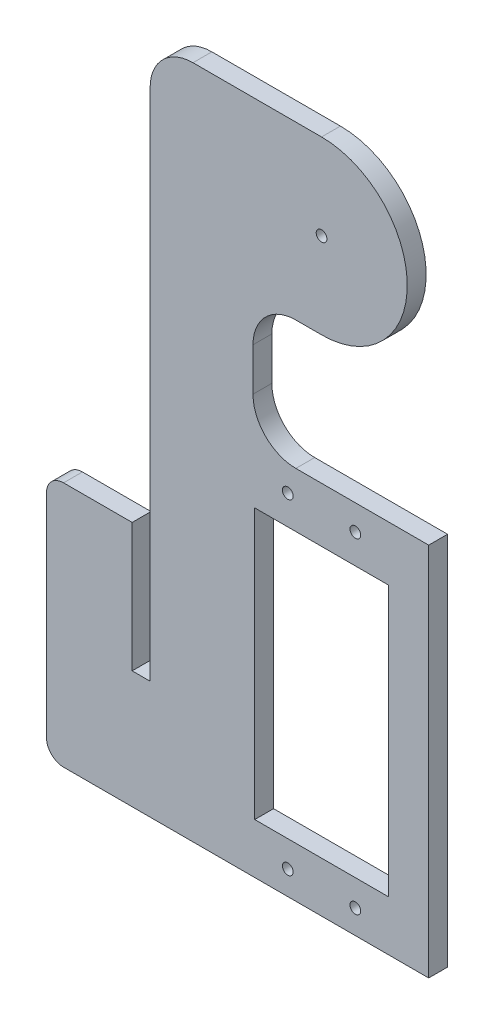
ISO-10303-21;
HEADER;
FILE_DESCRIPTION(('STEP AP214'),'2;1');
FILE_NAME('part.step','',(''),(''),'','','');
FILE_SCHEMA(('AUTOMOTIVE_DESIGN { 1 0 10303 214 1 1 1 1 }'));
ENDSEC;
DATA;
#1=APPLICATION_CONTEXT('core data for automotive mechanical design processes');
#2=APPLICATION_PROTOCOL_DEFINITION('international standard','automotive_design',2000,#1);
#3=PRODUCT_CONTEXT('',#1,'mechanical');
#4=PRODUCT('Part','Part','',(#3));
#5=PRODUCT_RELATED_PRODUCT_CATEGORY('part','',(#4));
#6=PRODUCT_DEFINITION_FORMATION('','',#4);
#7=PRODUCT_DEFINITION_CONTEXT('part definition',#1,'design');
#8=PRODUCT_DEFINITION('design','',#6,#7);
#9=PRODUCT_DEFINITION_SHAPE('','',#8);
#10=(LENGTH_UNIT() NAMED_UNIT(*) SI_UNIT(.MILLI.,.METRE.));
#11=(NAMED_UNIT(*) PLANE_ANGLE_UNIT() SI_UNIT($,.RADIAN.));
#12=(NAMED_UNIT(*) SI_UNIT($,.STERADIAN.) SOLID_ANGLE_UNIT());
#13=UNCERTAINTY_MEASURE_WITH_UNIT(LENGTH_MEASURE(1.E-05),#10,'distance_accuracy_value','');
#14=(GEOMETRIC_REPRESENTATION_CONTEXT(3) GLOBAL_UNCERTAINTY_ASSIGNED_CONTEXT((#13)) GLOBAL_UNIT_ASSIGNED_CONTEXT((#10,
#11,#12)) REPRESENTATION_CONTEXT('',''));
#15=CARTESIAN_POINT('',(0.,0.,0.));
#16=DIRECTION('',(0.,0.,1.));
#17=DIRECTION('',(1.,0.,0.));
#18=AXIS2_PLACEMENT_3D('',#15,#16,#17);
#19=CARTESIAN_POINT('',(34.925,92.0271852625298,2.794));
#20=DIRECTION('',(0.,0.,1.));
#21=DIRECTION('',(1.,0.,0.));
#22=AXIS2_PLACEMENT_3D('',#19,#20,#21);
#23=PLANE('',#22);
#24=CARTESIAN_POINT('',(29.9212,56.5179852625298,2.794));
#25=DIRECTION('',(0.,0.,1.));
#26=DIRECTION('',(1.,0.,0.));
#27=AXIS2_PLACEMENT_3D('',#24,#25,#26);
#28=CIRCLE('',#27,0.793749999999999);
#29=CARTESIAN_POINT('',(30.71495,56.5179852625298,2.794));
#30=VERTEX_POINT('',#29);
#31=EDGE_CURVE('E654',#30,#30,#28,.T.);
#32=ORIENTED_EDGE('',*,*,#31,.F.);
#33=EDGE_LOOP('',(#32));
#34=FACE_BOUND('',#33,.T.);
#35=CARTESIAN_POINT('',(34.925,92.0271852625298,2.794));
#36=DIRECTION('',(0.,0.,1.));
#37=DIRECTION('',(1.,0.,0.));
#38=AXIS2_PLACEMENT_3D('',#35,#36,#37);
#39=CIRCLE('',#38,0.793749999999993);
#40=CARTESIAN_POINT('',(35.71875,92.0271852625298,2.794));
#41=VERTEX_POINT('',#40);
#42=EDGE_CURVE('E666',#41,#41,#39,.T.);
#43=ORIENTED_EDGE('',*,*,#42,.F.);
#44=EDGE_LOOP('',(#43));
#45=FACE_BOUND('',#44,.T.);
#46=DIRECTION('',(-1.,0.,0.));
#47=VECTOR('',#46,1.);
#48=CARTESIAN_POINT('',(25.019,52.1771852625298,2.794));
#49=LINE('',#48,#47);
#50=CARTESIAN_POINT('',(44.831,52.1771852625298,2.794));
#51=VERTEX_POINT('',#50);
#52=CARTESIAN_POINT('',(25.019,52.1771852625298,2.794));
#53=VERTEX_POINT('',#52);
#54=EDGE_CURVE('E192',#51,#53,#49,.T.);
#55=ORIENTED_EDGE('',*,*,#54,.F.);
#56=DIRECTION('',(0.,1.,0.));
#57=VECTOR('',#56,1.);
#58=CARTESIAN_POINT('',(44.831,52.1771852625298,2.794));
#59=LINE('',#58,#57);
#60=CARTESIAN_POINT('',(44.831,12.1771852625298,2.794));
#61=VERTEX_POINT('',#60);
#62=EDGE_CURVE('E182',#61,#51,#59,.T.);
#63=ORIENTED_EDGE('',*,*,#62,.F.);
#64=DIRECTION('',(1.,0.,0.));
#65=VECTOR('',#64,1.);
#66=CARTESIAN_POINT('',(25.019,12.1771852625298,2.794));
#67=LINE('',#66,#65);
#68=CARTESIAN_POINT('',(25.019,12.1771852625298,2.794));
#69=VERTEX_POINT('',#68);
#70=EDGE_CURVE('E207',#69,#61,#67,.T.);
#71=ORIENTED_EDGE('',*,*,#70,.F.);
#72=DIRECTION('',(0.,-1.,0.));
#73=VECTOR('',#72,1.);
#74=CARTESIAN_POINT('',(25.019,52.1771852625298,2.794));
#75=LINE('',#74,#73);
#76=EDGE_CURVE('E205',#53,#69,#75,.T.);
#77=ORIENTED_EDGE('',*,*,#76,.F.);
#78=EDGE_LOOP('',(#55,#63,#71,#77));
#79=FACE_BOUND('',#78,.T.);
#80=DIRECTION('',(-1.,0.,0.));
#81=VECTOR('',#80,1.);
#82=CARTESIAN_POINT('',(-5.842,41.2271852625298,2.794));
#83=LINE('',#82,#81);
#84=CARTESIAN_POINT('',(6.858,41.2271852625298,2.794));
#85=VERTEX_POINT('',#84);
#86=CARTESIAN_POINT('',(-3.302,41.2271852625298,2.794));
#87=VERTEX_POINT('',#86);
#88=EDGE_CURVE('E245',#85,#87,#83,.T.);
#89=ORIENTED_EDGE('',*,*,#88,.T.);
#90=CARTESIAN_POINT('',(-3.302,38.6871852625298,2.794));
#91=DIRECTION('',(0.,0.,1.));
#92=DIRECTION('',(1.,0.,0.));
#93=AXIS2_PLACEMENT_3D('',#90,#91,#92);
#94=CIRCLE('',#93,2.54);
#95=CARTESIAN_POINT('',(-5.842,38.6871852625298,2.794));
#96=VERTEX_POINT('',#95);
#97=EDGE_CURVE('E43',#87,#96,#94,.T.);
#98=ORIENTED_EDGE('',*,*,#97,.T.);
#99=DIRECTION('',(0.,-1.,0.));
#100=VECTOR('',#99,1.);
#101=CARTESIAN_POINT('',(-5.842,4.73415976252982,2.794));
#102=LINE('',#101,#100);
#103=CARTESIAN_POINT('',(-5.842,7.27415976252982,2.794));
#104=VERTEX_POINT('',#103);
#105=EDGE_CURVE('E247',#96,#104,#102,.T.);
#106=ORIENTED_EDGE('',*,*,#105,.T.);
#107=CARTESIAN_POINT('',(-3.302,7.27415976252982,2.794));
#108=DIRECTION('',(0.,0.,1.));
#109=DIRECTION('',(1.,0.,0.));
#110=AXIS2_PLACEMENT_3D('',#107,#108,#109);
#111=CIRCLE('',#110,2.54);
#112=CARTESIAN_POINT('',(-3.302,4.73415976252982,2.794));
#113=VERTEX_POINT('',#112);
#114=EDGE_CURVE('E50',#104,#113,#111,.T.);
#115=ORIENTED_EDGE('',*,*,#114,.T.);
#116=DIRECTION('',(1.,0.,0.));
#117=VECTOR('',#116,1.);
#118=CARTESIAN_POINT('',(-5.842,4.73415976252982,2.794));
#119=LINE('',#118,#117);
#120=CARTESIAN_POINT('',(50.8,4.73415976252982,2.794));
#121=VERTEX_POINT('',#120);
#122=EDGE_CURVE('E249',#113,#121,#119,.T.);
#123=ORIENTED_EDGE('',*,*,#122,.T.);
#124=DIRECTION('',(0.,1.,0.));
#125=VECTOR('',#124,1.);
#126=CARTESIAN_POINT('',(50.8,4.73415976252982,2.794));
#127=LINE('',#126,#125);
#128=CARTESIAN_POINT('',(50.8,60.2847852625298,2.794));
#129=VERTEX_POINT('',#128);
#130=EDGE_CURVE('E251',#121,#129,#127,.T.);
#131=ORIENTED_EDGE('',*,*,#130,.T.);
#132=DIRECTION('',(-1.,0.,0.));
#133=VECTOR('',#132,1.);
#134=CARTESIAN_POINT('',(50.8,60.2847852625298,2.794));
#135=LINE('',#134,#133);
#136=CARTESIAN_POINT('',(31.115,60.2847852625298,2.794));
#137=VERTEX_POINT('',#136);
#138=EDGE_CURVE('E225',#129,#137,#135,.T.);
#139=ORIENTED_EDGE('',*,*,#138,.T.);
#140=CARTESIAN_POINT('',(31.115,66.6347852625298,2.794));
#141=DIRECTION('',(0.,0.,1.));
#142=DIRECTION('',(1.,0.,0.));
#143=AXIS2_PLACEMENT_3D('',#140,#141,#142);
#144=CIRCLE('',#143,6.35);
#145=CARTESIAN_POINT('',(24.765,66.6347852625298,2.794));
#146=VERTEX_POINT('',#145);
#147=EDGE_CURVE('E312',#137,#146,#144,.F.);
#148=ORIENTED_EDGE('',*,*,#147,.T.);
#149=DIRECTION('',(0.,1.,0.));
#150=VECTOR('',#149,1.);
#151=CARTESIAN_POINT('',(24.765,60.2847852625298,2.794));
#152=LINE('',#151,#150);
#153=CARTESIAN_POINT('',(24.765,72.9771852625298,2.794));
#154=VERTEX_POINT('',#153);
#155=EDGE_CURVE('E228',#146,#154,#152,.T.);
#156=ORIENTED_EDGE('',*,*,#155,.T.);
#157=CARTESIAN_POINT('',(31.115,72.9771852625298,2.794));
#158=DIRECTION('',(0.,0.,1.));
#159=DIRECTION('',(1.,0.,0.));
#160=AXIS2_PLACEMENT_3D('',#157,#158,#159);
#161=CIRCLE('',#160,6.35);
#162=CARTESIAN_POINT('',(31.115,79.3271852625298,2.794));
#163=VERTEX_POINT('',#162);
#164=EDGE_CURVE('E316',#154,#163,#161,.F.);
#165=ORIENTED_EDGE('',*,*,#164,.T.);
#166=DIRECTION('',(1.,0.,0.));
#167=VECTOR('',#166,1.);
#168=CARTESIAN_POINT('',(34.925,79.3271852625298,2.794));
#169=LINE('',#168,#167);
#170=CARTESIAN_POINT('',(34.925,79.3271852625298,2.794));
#171=VERTEX_POINT('',#170);
#172=EDGE_CURVE('E232',#163,#171,#169,.T.);
#173=ORIENTED_EDGE('',*,*,#172,.T.);
#174=CARTESIAN_POINT('',(34.925,92.0271852625298,2.794));
#175=DIRECTION('',(0.,0.,1.));
#176=DIRECTION('',(1.,0.,0.));
#177=AXIS2_PLACEMENT_3D('',#174,#175,#176);
#178=CIRCLE('',#177,12.7);
#179=CARTESIAN_POINT('',(34.925,104.72718526253,2.794));
#180=VERTEX_POINT('',#179);
#181=EDGE_CURVE('E234',#171,#180,#178,.T.);
#182=ORIENTED_EDGE('',*,*,#181,.T.);
#183=DIRECTION('',(-1.,0.,0.));
#184=VECTOR('',#183,1.);
#185=CARTESIAN_POINT('',(9.525,104.72718526253,2.794));
#186=LINE('',#185,#184);
#187=CARTESIAN_POINT('',(15.875,104.72718526253,2.794));
#188=VERTEX_POINT('',#187);
#189=EDGE_CURVE('E236',#180,#188,#186,.T.);
#190=ORIENTED_EDGE('',*,*,#189,.T.);
#191=CARTESIAN_POINT('',(15.875,98.3771852625298,2.794));
#192=DIRECTION('',(0.,0.,1.));
#193=DIRECTION('',(1.,0.,0.));
#194=AXIS2_PLACEMENT_3D('',#191,#192,#193);
#195=CIRCLE('',#194,6.35);
#196=CARTESIAN_POINT('',(9.525,98.3771852625298,2.794));
#197=VERTEX_POINT('',#196);
#198=EDGE_CURVE('E325',#188,#197,#195,.T.);
#199=ORIENTED_EDGE('',*,*,#198,.T.);
#200=DIRECTION('',(0.,-1.,0.));
#201=VECTOR('',#200,1.);
#202=CARTESIAN_POINT('',(9.525,38.1,2.794));
#203=LINE('',#202,#201);
#204=CARTESIAN_POINT('',(9.525,22.1771852625298,2.794));
#205=VERTEX_POINT('',#204);
#206=EDGE_CURVE('E239',#197,#205,#203,.T.);
#207=ORIENTED_EDGE('',*,*,#206,.T.);
#208=DIRECTION('',(-1.,0.,0.));
#209=VECTOR('',#208,1.);
#210=CARTESIAN_POINT('',(6.858,22.1771852625298,2.794));
#211=LINE('',#210,#209);
#212=CARTESIAN_POINT('',(6.858,22.1771852625298,2.794));
#213=VERTEX_POINT('',#212);
#214=EDGE_CURVE('E241',#205,#213,#211,.T.);
#215=ORIENTED_EDGE('',*,*,#214,.T.);
#216=DIRECTION('',(0.,1.,0.));
#217=VECTOR('',#216,1.);
#218=CARTESIAN_POINT('',(6.858,41.2271852625298,2.794));
#219=LINE('',#218,#217);
#220=EDGE_CURVE('E243',#213,#85,#219,.T.);
#221=ORIENTED_EDGE('',*,*,#220,.T.);
#222=EDGE_LOOP('',(#89,#98,#106,#115,#123,#131,#139,#148,#156,#165,#173,#182,#190,#199,#207,
#215,#221));
#223=FACE_BOUND('',#222,.T.);
#224=CARTESIAN_POINT('',(29.9212,8.28338526252981,2.794));
#225=DIRECTION('',(0.,0.,1.));
#226=DIRECTION('',(1.,0.,0.));
#227=AXIS2_PLACEMENT_3D('',#224,#225,#226);
#228=CIRCLE('',#227,0.793749999999999);
#229=CARTESIAN_POINT('',(30.71495,8.28338526252981,2.794));
#230=VERTEX_POINT('',#229);
#231=EDGE_CURVE('E214',#230,#230,#228,.T.);
#232=ORIENTED_EDGE('',*,*,#231,.F.);
#233=EDGE_LOOP('',(#232));
#234=FACE_BOUND('',#233,.T.);
#235=CARTESIAN_POINT('',(39.9288,8.28338526252981,2.794));
#236=DIRECTION('',(0.,0.,1.));
#237=DIRECTION('',(1.,0.,0.));
#238=AXIS2_PLACEMENT_3D('',#235,#236,#237);
#239=CIRCLE('',#238,0.79375);
#240=CARTESIAN_POINT('',(40.72255,8.28338526252981,2.794));
#241=VERTEX_POINT('',#240);
#242=EDGE_CURVE('E660',#241,#241,#239,.T.);
#243=ORIENTED_EDGE('',*,*,#242,.F.);
#244=EDGE_LOOP('',(#243));
#245=FACE_BOUND('',#244,.T.);
#246=CARTESIAN_POINT('',(39.9288,56.5179852625298,2.794));
#247=DIRECTION('',(0.,0.,1.));
#248=DIRECTION('',(1.,0.,0.));
#249=AXIS2_PLACEMENT_3D('',#246,#247,#248);
#250=CIRCLE('',#249,0.793749999999999);
#251=CARTESIAN_POINT('',(40.72255,56.5179852625298,2.794));
#252=VERTEX_POINT('',#251);
#253=EDGE_CURVE('E645',#252,#252,#250,.T.);
#254=ORIENTED_EDGE('',*,*,#253,.F.);
#255=EDGE_LOOP('',(#254));
#256=FACE_BOUND('',#255,.T.);
#257=ADVANCED_FACE('F35',(#34,#45,#79,#223,#234,#245,#256),#23,.T.);
#258=CARTESIAN_POINT('',(34.925,92.0271852625298,0.));
#259=DIRECTION('',(0.,0.,1.));
#260=DIRECTION('',(1.,0.,0.));
#261=AXIS2_PLACEMENT_3D('',#258,#259,#260);
#262=PLANE('',#261);
#263=CARTESIAN_POINT('',(29.9212,56.5179852625298,0.));
#264=DIRECTION('',(0.,0.,1.));
#265=DIRECTION('',(1.,0.,0.));
#266=AXIS2_PLACEMENT_3D('',#263,#264,#265);
#267=CIRCLE('',#266,0.793749999999999);
#268=CARTESIAN_POINT('',(30.71495,56.5179852625298,0.));
#269=VERTEX_POINT('',#268);
#270=EDGE_CURVE('E651',#269,#269,#267,.T.);
#271=ORIENTED_EDGE('',*,*,#270,.T.);
#272=EDGE_LOOP('',(#271));
#273=FACE_BOUND('',#272,.T.);
#274=CARTESIAN_POINT('',(34.925,92.0271852625298,0.));
#275=DIRECTION('',(0.,0.,1.));
#276=DIRECTION('',(1.,0.,0.));
#277=AXIS2_PLACEMENT_3D('',#274,#275,#276);
#278=CIRCLE('',#277,0.793749999999993);
#279=CARTESIAN_POINT('',(35.71875,92.0271852625298,0.));
#280=VERTEX_POINT('',#279);
#281=EDGE_CURVE('E663',#280,#280,#278,.T.);
#282=ORIENTED_EDGE('',*,*,#281,.T.);
#283=EDGE_LOOP('',(#282));
#284=FACE_BOUND('',#283,.T.);
#285=DIRECTION('',(0.,1.,0.));
#286=VECTOR('',#285,1.);
#287=CARTESIAN_POINT('',(44.831,52.1771852625298,0.));
#288=LINE('',#287,#286);
#289=CARTESIAN_POINT('',(44.831,12.1771852625298,0.));
#290=VERTEX_POINT('',#289);
#291=CARTESIAN_POINT('',(44.831,52.1771852625298,0.));
#292=VERTEX_POINT('',#291);
#293=EDGE_CURVE('E212',#290,#292,#288,.T.);
#294=ORIENTED_EDGE('',*,*,#293,.T.);
#295=DIRECTION('',(-1.,0.,0.));
#296=VECTOR('',#295,1.);
#297=CARTESIAN_POINT('',(25.019,52.1771852625298,0.));
#298=LINE('',#297,#296);
#299=CARTESIAN_POINT('',(25.019,52.1771852625298,0.));
#300=VERTEX_POINT('',#299);
#301=EDGE_CURVE('E199',#292,#300,#298,.T.);
#302=ORIENTED_EDGE('',*,*,#301,.T.);
#303=DIRECTION('',(0.,-1.,0.));
#304=VECTOR('',#303,1.);
#305=CARTESIAN_POINT('',(25.019,52.1771852625298,0.));
#306=LINE('',#305,#304);
#307=CARTESIAN_POINT('',(25.019,12.1771852625298,0.));
#308=VERTEX_POINT('',#307);
#309=EDGE_CURVE('E216',#300,#308,#306,.T.);
#310=ORIENTED_EDGE('',*,*,#309,.T.);
#311=DIRECTION('',(1.,0.,0.));
#312=VECTOR('',#311,1.);
#313=CARTESIAN_POINT('',(25.019,12.1771852625298,0.));
#314=LINE('',#313,#312);
#315=EDGE_CURVE('E193',#308,#290,#314,.T.);
#316=ORIENTED_EDGE('',*,*,#315,.T.);
#317=EDGE_LOOP('',(#294,#302,#310,#316));
#318=FACE_BOUND('',#317,.T.);
#319=DIRECTION('',(0.,-1.,0.));
#320=VECTOR('',#319,1.);
#321=CARTESIAN_POINT('',(-5.842,4.73415976252982,0.));
#322=LINE('',#321,#320);
#323=CARTESIAN_POINT('',(-5.842,38.6871852625298,0.));
#324=VERTEX_POINT('',#323);
#325=CARTESIAN_POINT('',(-5.842,7.27415976252982,0.));
#326=VERTEX_POINT('',#325);
#327=EDGE_CURVE('E274',#324,#326,#322,.T.);
#328=ORIENTED_EDGE('',*,*,#327,.F.);
#329=CARTESIAN_POINT('',(-3.302,38.6871852625298,0.));
#330=DIRECTION('',(0.,0.,1.));
#331=DIRECTION('',(1.,0.,0.));
#332=AXIS2_PLACEMENT_3D('',#329,#330,#331);
#333=CIRCLE('',#332,2.54);
#334=CARTESIAN_POINT('',(-3.302,41.2271852625298,0.));
#335=VERTEX_POINT('',#334);
#336=EDGE_CURVE('E334',#324,#335,#333,.F.);
#337=ORIENTED_EDGE('',*,*,#336,.T.);
#338=DIRECTION('',(-1.,0.,0.));
#339=VECTOR('',#338,1.);
#340=CARTESIAN_POINT('',(-5.842,41.2271852625298,0.));
#341=LINE('',#340,#339);
#342=CARTESIAN_POINT('',(6.858,41.2271852625298,0.));
#343=VERTEX_POINT('',#342);
#344=EDGE_CURVE('E272',#343,#335,#341,.T.);
#345=ORIENTED_EDGE('',*,*,#344,.F.);
#346=DIRECTION('',(0.,1.,0.));
#347=VECTOR('',#346,1.);
#348=CARTESIAN_POINT('',(6.858,41.2271852625298,0.));
#349=LINE('',#348,#347);
#350=CARTESIAN_POINT('',(6.858,22.1771852625298,0.));
#351=VERTEX_POINT('',#350);
#352=EDGE_CURVE('E270',#351,#343,#349,.T.);
#353=ORIENTED_EDGE('',*,*,#352,.F.);
#354=DIRECTION('',(-1.,0.,0.));
#355=VECTOR('',#354,1.);
#356=CARTESIAN_POINT('',(6.858,22.1771852625298,0.));
#357=LINE('',#356,#355);
#358=CARTESIAN_POINT('',(9.525,22.1771852625298,0.));
#359=VERTEX_POINT('',#358);
#360=EDGE_CURVE('E268',#359,#351,#357,.T.);
#361=ORIENTED_EDGE('',*,*,#360,.F.);
#362=DIRECTION('',(0.,-1.,0.));
#363=VECTOR('',#362,1.);
#364=CARTESIAN_POINT('',(9.525,38.1,0.));
#365=LINE('',#364,#363);
#366=CARTESIAN_POINT('',(9.525,98.3771852625298,0.));
#367=VERTEX_POINT('',#366);
#368=EDGE_CURVE('E266',#367,#359,#365,.T.);
#369=ORIENTED_EDGE('',*,*,#368,.F.);
#370=CARTESIAN_POINT('',(15.875,98.3771852625298,0.));
#371=DIRECTION('',(0.,0.,1.));
#372=DIRECTION('',(1.,0.,0.));
#373=AXIS2_PLACEMENT_3D('',#370,#371,#372);
#374=CIRCLE('',#373,6.35);
#375=CARTESIAN_POINT('',(15.875,104.72718526253,0.));
#376=VERTEX_POINT('',#375);
#377=EDGE_CURVE('E321',#367,#376,#374,.F.);
#378=ORIENTED_EDGE('',*,*,#377,.T.);
#379=DIRECTION('',(-1.,0.,0.));
#380=VECTOR('',#379,1.);
#381=CARTESIAN_POINT('',(9.525,104.72718526253,0.));
#382=LINE('',#381,#380);
#383=CARTESIAN_POINT('',(34.925,104.72718526253,0.));
#384=VERTEX_POINT('',#383);
#385=EDGE_CURVE('E263',#384,#376,#382,.T.);
#386=ORIENTED_EDGE('',*,*,#385,.F.);
#387=CARTESIAN_POINT('',(34.925,92.0271852625298,0.));
#388=DIRECTION('',(0.,0.,1.));
#389=DIRECTION('',(1.,0.,0.));
#390=AXIS2_PLACEMENT_3D('',#387,#388,#389);
#391=CIRCLE('',#390,12.7);
#392=CARTESIAN_POINT('',(34.925,79.3271852625298,0.));
#393=VERTEX_POINT('',#392);
#394=EDGE_CURVE('E261',#393,#384,#391,.T.);
#395=ORIENTED_EDGE('',*,*,#394,.F.);
#396=DIRECTION('',(1.,0.,0.));
#397=VECTOR('',#396,1.);
#398=CARTESIAN_POINT('',(34.925,79.3271852625298,0.));
#399=LINE('',#398,#397);
#400=CARTESIAN_POINT('',(31.115,79.3271852625298,0.));
#401=VERTEX_POINT('',#400);
#402=EDGE_CURVE('E259',#401,#393,#399,.T.);
#403=ORIENTED_EDGE('',*,*,#402,.F.);
#404=CARTESIAN_POINT('',(31.115,72.9771852625298,0.));
#405=DIRECTION('',(0.,0.,1.));
#406=DIRECTION('',(1.,0.,0.));
#407=AXIS2_PLACEMENT_3D('',#404,#405,#406);
#408=CIRCLE('',#407,6.35);
#409=CARTESIAN_POINT('',(24.765,72.9771852625298,0.));
#410=VERTEX_POINT('',#409);
#411=EDGE_CURVE('E314',#401,#410,#408,.T.);
#412=ORIENTED_EDGE('',*,*,#411,.T.);
#413=DIRECTION('',(0.,1.,0.));
#414=VECTOR('',#413,1.);
#415=CARTESIAN_POINT('',(24.765,60.2847852625298,0.));
#416=LINE('',#415,#414);
#417=CARTESIAN_POINT('',(24.765,66.6347852625298,0.));
#418=VERTEX_POINT('',#417);
#419=EDGE_CURVE('E256',#418,#410,#416,.T.);
#420=ORIENTED_EDGE('',*,*,#419,.F.);
#421=CARTESIAN_POINT('',(31.115,66.6347852625298,0.));
#422=DIRECTION('',(0.,0.,1.));
#423=DIRECTION('',(1.,0.,0.));
#424=AXIS2_PLACEMENT_3D('',#421,#422,#423);
#425=CIRCLE('',#424,6.35);
#426=CARTESIAN_POINT('',(31.115,60.2847852625298,0.));
#427=VERTEX_POINT('',#426);
#428=EDGE_CURVE('E310',#418,#427,#425,.T.);
#429=ORIENTED_EDGE('',*,*,#428,.T.);
#430=DIRECTION('',(-1.,0.,0.));
#431=VECTOR('',#430,1.);
#432=CARTESIAN_POINT('',(50.8,60.2847852625298,0.));
#433=LINE('',#432,#431);
#434=CARTESIAN_POINT('',(50.8,60.2847852625298,0.));
#435=VERTEX_POINT('',#434);
#436=EDGE_CURVE('E200',#435,#427,#433,.T.);
#437=ORIENTED_EDGE('',*,*,#436,.F.);
#438=DIRECTION('',(0.,1.,0.));
#439=VECTOR('',#438,1.);
#440=CARTESIAN_POINT('',(50.8,36.3431526223296,0.));
#441=LINE('',#440,#439);
#442=CARTESIAN_POINT('',(50.8,4.73415976252982,0.));
#443=VERTEX_POINT('',#442);
#444=EDGE_CURVE('E229',#443,#435,#441,.T.);
#445=ORIENTED_EDGE('',*,*,#444,.F.);
#446=DIRECTION('',(1.,0.,0.));
#447=VECTOR('',#446,1.);
#448=CARTESIAN_POINT('',(-5.842,4.73415976252982,0.));
#449=LINE('',#448,#447);
#450=CARTESIAN_POINT('',(-3.302,4.73415976252982,0.));
#451=VERTEX_POINT('',#450);
#452=EDGE_CURVE('E277',#451,#443,#449,.T.);
#453=ORIENTED_EDGE('',*,*,#452,.F.);
#454=CARTESIAN_POINT('',(-3.302,7.27415976252982,0.));
#455=DIRECTION('',(0.,0.,1.));
#456=DIRECTION('',(1.,0.,0.));
#457=AXIS2_PLACEMENT_3D('',#454,#455,#456);
#458=CIRCLE('',#457,2.54);
#459=EDGE_CURVE('E332',#451,#326,#458,.F.);
#460=ORIENTED_EDGE('',*,*,#459,.T.);
#461=EDGE_LOOP('',(#328,#337,#345,#353,#361,#369,#378,#386,#395,#403,#412,#420,#429,#437,#445,
#453,#460));
#462=FACE_BOUND('',#461,.T.);
#463=CARTESIAN_POINT('',(29.9212,8.28338526252981,0.));
#464=DIRECTION('',(0.,0.,1.));
#465=DIRECTION('',(1.,0.,0.));
#466=AXIS2_PLACEMENT_3D('',#463,#464,#465);
#467=CIRCLE('',#466,0.793749999999999);
#468=CARTESIAN_POINT('',(30.71495,8.28338526252981,0.));
#469=VERTEX_POINT('',#468);
#470=EDGE_CURVE('E669',#469,#469,#467,.T.);
#471=ORIENTED_EDGE('',*,*,#470,.T.);
#472=EDGE_LOOP('',(#471));
#473=FACE_BOUND('',#472,.T.);
#474=CARTESIAN_POINT('',(39.9288,8.28338526252981,0.));
#475=DIRECTION('',(0.,0.,1.));
#476=DIRECTION('',(1.,0.,0.));
#477=AXIS2_PLACEMENT_3D('',#474,#475,#476);
#478=CIRCLE('',#477,0.79375);
#479=CARTESIAN_POINT('',(40.72255,8.28338526252981,0.));
#480=VERTEX_POINT('',#479);
#481=EDGE_CURVE('E657',#480,#480,#478,.T.);
#482=ORIENTED_EDGE('',*,*,#481,.T.);
#483=EDGE_LOOP('',(#482));
#484=FACE_BOUND('',#483,.T.);
#485=CARTESIAN_POINT('',(39.9288,56.5179852625298,0.));
#486=DIRECTION('',(0.,0.,1.));
#487=DIRECTION('',(1.,0.,0.));
#488=AXIS2_PLACEMENT_3D('',#485,#486,#487);
#489=CIRCLE('',#488,0.793749999999999);
#490=CARTESIAN_POINT('',(40.72255,56.5179852625298,0.));
#491=VERTEX_POINT('',#490);
#492=EDGE_CURVE('E648',#491,#491,#489,.T.);
#493=ORIENTED_EDGE('',*,*,#492,.T.);
#494=EDGE_LOOP('',(#493));
#495=FACE_BOUND('',#494,.T.);
#496=ADVANCED_FACE('F349',(#273,#284,#318,#462,#473,#484,#495),#262,.F.);
#497=CARTESIAN_POINT('',(50.8,60.2847852625298,2.794));
#498=DIRECTION('',(0.,-1.,0.));
#499=DIRECTION('',(1.,0.,0.));
#500=AXIS2_PLACEMENT_3D('',#497,#498,#499);
#501=PLANE('',#500);
#502=ORIENTED_EDGE('',*,*,#436,.T.);
#503=DIRECTION('',(0.,0.,-1.));
#504=VECTOR('',#503,1.);
#505=CARTESIAN_POINT('',(31.115,60.2847852625298,2.794));
#506=LINE('',#505,#504);
#507=EDGE_CURVE('E305',#427,#137,#506,.F.);
#508=ORIENTED_EDGE('',*,*,#507,.T.);
#509=ORIENTED_EDGE('',*,*,#138,.F.);
#510=DIRECTION('',(0.,0.,-1.));
#511=VECTOR('',#510,1.);
#512=CARTESIAN_POINT('',(50.8,60.2847852625298,2.794));
#513=LINE('',#512,#511);
#514=EDGE_CURVE('E253',#129,#435,#513,.T.);
#515=ORIENTED_EDGE('',*,*,#514,.T.);
#516=EDGE_LOOP('',(#502,#508,#509,#515));
#517=FACE_BOUND('',#516,.T.);
#518=ADVANCED_FACE('F404',(#517),#501,.F.);
#519=CARTESIAN_POINT('',(24.765,60.2847852625298,2.794));
#520=DIRECTION('',(-1.,0.,0.));
#521=DIRECTION('',(0.,0.,1.));
#522=AXIS2_PLACEMENT_3D('',#519,#520,#521);
#523=PLANE('',#522);
#524=ORIENTED_EDGE('',*,*,#155,.F.);
#525=DIRECTION('',(0.,0.,-1.));
#526=VECTOR('',#525,1.);
#527=CARTESIAN_POINT('',(24.765,66.6347852625298,0.));
#528=LINE('',#527,#526);
#529=EDGE_CURVE('E302',#146,#418,#528,.T.);
#530=ORIENTED_EDGE('',*,*,#529,.T.);
#531=ORIENTED_EDGE('',*,*,#419,.T.);
#532=DIRECTION('',(0.,0.,-1.));
#533=VECTOR('',#532,1.);
#534=CARTESIAN_POINT('',(24.765,72.9771852625298,2.794));
#535=LINE('',#534,#533);
#536=EDGE_CURVE('E300',#410,#154,#535,.F.);
#537=ORIENTED_EDGE('',*,*,#536,.T.);
#538=EDGE_LOOP('',(#524,#530,#531,#537));
#539=FACE_BOUND('',#538,.T.);
#540=ADVANCED_FACE('F394',(#539),#523,.F.);
#541=CARTESIAN_POINT('',(34.925,79.3271852625298,2.794));
#542=DIRECTION('',(0.,1.,0.));
#543=DIRECTION('',(0.,0.,1.));
#544=AXIS2_PLACEMENT_3D('',#541,#542,#543);
#545=PLANE('',#544);
#546=ORIENTED_EDGE('',*,*,#172,.F.);
#547=DIRECTION('',(0.,0.,-1.));
#548=VECTOR('',#547,1.);
#549=CARTESIAN_POINT('',(31.115,79.3271852625298,0.));
#550=LINE('',#549,#548);
#551=EDGE_CURVE('E307',#163,#401,#550,.T.);
#552=ORIENTED_EDGE('',*,*,#551,.T.);
#553=ORIENTED_EDGE('',*,*,#402,.T.);
#554=DIRECTION('',(0.,0.,-1.));
#555=VECTOR('',#554,1.);
#556=CARTESIAN_POINT('',(34.925,79.3271852625298,2.794));
#557=LINE('',#556,#555);
#558=EDGE_CURVE('E297',#171,#393,#557,.T.);
#559=ORIENTED_EDGE('',*,*,#558,.F.);
#560=EDGE_LOOP('',(#546,#552,#553,#559));
#561=FACE_BOUND('',#560,.T.);
#562=ADVANCED_FACE('F386',(#561),#545,.F.);
#563=CARTESIAN_POINT('',(34.925,92.0271852625298,2.794));
#564=DIRECTION('',(0.,0.,-1.));
#565=DIRECTION('',(-1.,0.,0.));
#566=AXIS2_PLACEMENT_3D('',#563,#564,#565);
#567=CYLINDRICAL_SURFACE('',#566,12.7);
#568=ORIENTED_EDGE('',*,*,#394,.T.);
#569=DIRECTION('',(0.,0.,-1.));
#570=VECTOR('',#569,1.);
#571=CARTESIAN_POINT('',(34.925,104.72718526253,2.794));
#572=LINE('',#571,#570);
#573=EDGE_CURVE('E294',#180,#384,#572,.T.);
#574=ORIENTED_EDGE('',*,*,#573,.F.);
#575=ORIENTED_EDGE('',*,*,#181,.F.);
#576=ORIENTED_EDGE('',*,*,#558,.T.);
#577=EDGE_LOOP('',(#568,#574,#575,#576));
#578=FACE_BOUND('',#577,.T.);
#579=ADVANCED_FACE('F380',(#578),#567,.T.);
#580=CARTESIAN_POINT('',(9.525,104.72718526253,2.794));
#581=DIRECTION('',(0.,-1.,0.));
#582=DIRECTION('',(0.,0.,-1.));
#583=AXIS2_PLACEMENT_3D('',#580,#581,#582);
#584=PLANE('',#583);
#585=ORIENTED_EDGE('',*,*,#385,.T.);
#586=DIRECTION('',(0.,0.,-1.));
#587=VECTOR('',#586,1.);
#588=CARTESIAN_POINT('',(15.875,104.72718526253,2.794));
#589=LINE('',#588,#587);
#590=EDGE_CURVE('E323',#376,#188,#589,.F.);
#591=ORIENTED_EDGE('',*,*,#590,.T.);
#592=ORIENTED_EDGE('',*,*,#189,.F.);
#593=ORIENTED_EDGE('',*,*,#573,.T.);
#594=EDGE_LOOP('',(#585,#591,#592,#593));
#595=FACE_BOUND('',#594,.T.);
#596=ADVANCED_FACE('F375',(#595),#584,.F.);
#597=CARTESIAN_POINT('',(9.525,38.1,2.794));
#598=DIRECTION('',(1.,0.,0.));
#599=DIRECTION('',(0.,0.,-1.));
#600=AXIS2_PLACEMENT_3D('',#597,#598,#599);
#601=PLANE('',#600);
#602=ORIENTED_EDGE('',*,*,#206,.F.);
#603=DIRECTION('',(0.,0.,-1.));
#604=VECTOR('',#603,1.);
#605=CARTESIAN_POINT('',(9.525,98.3771852625298,2.794));
#606=LINE('',#605,#604);
#607=EDGE_CURVE('E318',#197,#367,#606,.T.);
#608=ORIENTED_EDGE('',*,*,#607,.T.);
#609=ORIENTED_EDGE('',*,*,#368,.T.);
#610=DIRECTION('',(0.,0.,-1.));
#611=VECTOR('',#610,1.);
#612=CARTESIAN_POINT('',(9.525,22.1771852625298,2.794));
#613=LINE('',#612,#611);
#614=EDGE_CURVE('E291',#205,#359,#613,.T.);
#615=ORIENTED_EDGE('',*,*,#614,.F.);
#616=EDGE_LOOP('',(#602,#608,#609,#615));
#617=FACE_BOUND('',#616,.T.);
#618=ADVANCED_FACE('F366',(#617),#601,.F.);
#619=CARTESIAN_POINT('',(6.858,22.1771852625298,2.794));
#620=DIRECTION('',(0.,-1.,0.));
#621=DIRECTION('',(0.,0.,-1.));
#622=AXIS2_PLACEMENT_3D('',#619,#620,#621);
#623=PLANE('',#622);
#624=ORIENTED_EDGE('',*,*,#360,.T.);
#625=DIRECTION('',(0.,0.,-1.));
#626=VECTOR('',#625,1.);
#627=CARTESIAN_POINT('',(6.858,22.1771852625298,2.794));
#628=LINE('',#627,#626);
#629=EDGE_CURVE('E288',#213,#351,#628,.T.);
#630=ORIENTED_EDGE('',*,*,#629,.F.);
#631=ORIENTED_EDGE('',*,*,#214,.F.);
#632=ORIENTED_EDGE('',*,*,#614,.T.);
#633=EDGE_LOOP('',(#624,#630,#631,#632));
#634=FACE_BOUND('',#633,.T.);
#635=ADVANCED_FACE('F361',(#634),#623,.F.);
#636=CARTESIAN_POINT('',(6.858,41.2271852625298,2.794));
#637=DIRECTION('',(-1.,0.,0.));
#638=DIRECTION('',(0.,-1.,0.));
#639=AXIS2_PLACEMENT_3D('',#636,#637,#638);
#640=PLANE('',#639);
#641=ORIENTED_EDGE('',*,*,#352,.T.);
#642=DIRECTION('',(0.,0.,-1.));
#643=VECTOR('',#642,1.);
#644=CARTESIAN_POINT('',(6.858,41.2271852625298,2.794));
#645=LINE('',#644,#643);
#646=EDGE_CURVE('E285',#85,#343,#645,.T.);
#647=ORIENTED_EDGE('',*,*,#646,.F.);
#648=ORIENTED_EDGE('',*,*,#220,.F.);
#649=ORIENTED_EDGE('',*,*,#629,.T.);
#650=EDGE_LOOP('',(#641,#647,#648,#649));
#651=FACE_BOUND('',#650,.T.);
#652=ADVANCED_FACE('F356',(#651),#640,.F.);
#653=CARTESIAN_POINT('',(-5.842,41.2271852625298,2.794));
#654=DIRECTION('',(0.,-1.,0.));
#655=DIRECTION('',(0.,0.,-1.));
#656=AXIS2_PLACEMENT_3D('',#653,#654,#655);
#657=PLANE('',#656);
#658=ORIENTED_EDGE('',*,*,#344,.T.);
#659=DIRECTION('',(0.,0.,-1.));
#660=VECTOR('',#659,1.);
#661=CARTESIAN_POINT('',(-3.302,41.2271852625298,2.794));
#662=LINE('',#661,#660);
#663=EDGE_CURVE('E58',#335,#87,#662,.F.);
#664=ORIENTED_EDGE('',*,*,#663,.T.);
#665=ORIENTED_EDGE('',*,*,#88,.F.);
#666=ORIENTED_EDGE('',*,*,#646,.T.);
#667=EDGE_LOOP('',(#658,#664,#665,#666));
#668=FACE_BOUND('',#667,.T.);
#669=ADVANCED_FACE('F352',(#668),#657,.F.);
#670=CARTESIAN_POINT('',(-5.842,4.73415976252982,2.794));
#671=DIRECTION('',(1.,0.,0.));
#672=DIRECTION('',(0.,1.,0.));
#673=AXIS2_PLACEMENT_3D('',#670,#671,#672);
#674=PLANE('',#673);
#675=ORIENTED_EDGE('',*,*,#105,.F.);
#676=DIRECTION('',(0.,0.,-1.));
#677=VECTOR('',#676,1.);
#678=CARTESIAN_POINT('',(-5.842,38.6871852625298,2.794));
#679=LINE('',#678,#677);
#680=EDGE_CURVE('E329',#96,#324,#679,.T.);
#681=ORIENTED_EDGE('',*,*,#680,.T.);
#682=ORIENTED_EDGE('',*,*,#327,.T.);
#683=DIRECTION('',(0.,0.,-1.));
#684=VECTOR('',#683,1.);
#685=CARTESIAN_POINT('',(-5.842,7.27415976252982,2.794));
#686=LINE('',#685,#684);
#687=EDGE_CURVE('E327',#326,#104,#686,.F.);
#688=ORIENTED_EDGE('',*,*,#687,.T.);
#689=EDGE_LOOP('',(#675,#681,#682,#688));
#690=FACE_BOUND('',#689,.T.);
#691=ADVANCED_FACE('F343',(#690),#674,.F.);
#692=CARTESIAN_POINT('',(-5.842,4.73415976252982,2.794));
#693=DIRECTION('',(0.,1.,0.));
#694=DIRECTION('',(-1.,0.,0.));
#695=AXIS2_PLACEMENT_3D('',#692,#693,#694);
#696=PLANE('',#695);
#697=ORIENTED_EDGE('',*,*,#122,.F.);
#698=DIRECTION('',(0.,0.,-1.));
#699=VECTOR('',#698,1.);
#700=CARTESIAN_POINT('',(-3.302,4.73415976252982,2.794));
#701=LINE('',#700,#699);
#702=EDGE_CURVE('E11',#113,#451,#701,.T.);
#703=ORIENTED_EDGE('',*,*,#702,.T.);
#704=ORIENTED_EDGE('',*,*,#452,.T.);
#705=DIRECTION('',(0.,0.,-1.));
#706=VECTOR('',#705,1.);
#707=CARTESIAN_POINT('',(50.8,4.73415976252982,2.794));
#708=LINE('',#707,#706);
#709=EDGE_CURVE('E282',#121,#443,#708,.T.);
#710=ORIENTED_EDGE('',*,*,#709,.F.);
#711=EDGE_LOOP('',(#697,#703,#704,#710));
#712=FACE_BOUND('',#711,.T.);
#713=ADVANCED_FACE('F412',(#712),#696,.F.);
#714=CARTESIAN_POINT('',(50.8,36.3431526223296,2.794));
#715=DIRECTION('',(-1.,0.,0.));
#716=DIRECTION('',(0.,0.,1.));
#717=AXIS2_PLACEMENT_3D('',#714,#715,#716);
#718=PLANE('',#717);
#719=ORIENTED_EDGE('',*,*,#444,.T.);
#720=ORIENTED_EDGE('',*,*,#514,.F.);
#721=ORIENTED_EDGE('',*,*,#130,.F.);
#722=ORIENTED_EDGE('',*,*,#709,.T.);
#723=EDGE_LOOP('',(#719,#720,#721,#722));
#724=FACE_BOUND('',#723,.T.);
#725=ADVANCED_FACE('F408',(#724),#718,.F.);
#726=CARTESIAN_POINT('',(44.831,52.1771852625298,2.794));
#727=DIRECTION('',(-1.,0.,0.));
#728=DIRECTION('',(0.,-1.,0.));
#729=AXIS2_PLACEMENT_3D('',#726,#727,#728);
#730=PLANE('',#729);
#731=ORIENTED_EDGE('',*,*,#293,.F.);
#732=DIRECTION('',(0.,0.,-1.));
#733=VECTOR('',#732,1.);
#734=CARTESIAN_POINT('',(44.831,12.1771852625298,2.794));
#735=LINE('',#734,#733);
#736=EDGE_CURVE('E188',#61,#290,#735,.T.);
#737=ORIENTED_EDGE('',*,*,#736,.F.);
#738=ORIENTED_EDGE('',*,*,#62,.T.);
#739=DIRECTION('',(0.,0.,-1.));
#740=VECTOR('',#739,1.);
#741=CARTESIAN_POINT('',(44.831,52.1771852625298,2.794));
#742=LINE('',#741,#740);
#743=EDGE_CURVE('E185',#51,#292,#742,.T.);
#744=ORIENTED_EDGE('',*,*,#743,.T.);
#745=EDGE_LOOP('',(#731,#737,#738,#744));
#746=FACE_BOUND('',#745,.T.);
#747=ADVANCED_FACE('F184',(#746),#730,.T.);
#748=CARTESIAN_POINT('',(25.019,52.1771852625298,2.794));
#749=DIRECTION('',(0.,-1.,0.));
#750=DIRECTION('',(1.,0.,0.));
#751=AXIS2_PLACEMENT_3D('',#748,#749,#750);
#752=PLANE('',#751);
#753=ORIENTED_EDGE('',*,*,#301,.F.);
#754=ORIENTED_EDGE('',*,*,#743,.F.);
#755=ORIENTED_EDGE('',*,*,#54,.T.);
#756=DIRECTION('',(0.,0.,-1.));
#757=VECTOR('',#756,1.);
#758=CARTESIAN_POINT('',(25.019,52.1771852625298,2.794));
#759=LINE('',#758,#757);
#760=EDGE_CURVE('E201',#53,#300,#759,.T.);
#761=ORIENTED_EDGE('',*,*,#760,.T.);
#762=EDGE_LOOP('',(#753,#754,#755,#761));
#763=FACE_BOUND('',#762,.T.);
#764=ADVANCED_FACE('F196',(#763),#752,.T.);
#765=CARTESIAN_POINT('',(25.019,52.1771852625298,2.794));
#766=DIRECTION('',(1.,0.,0.));
#767=DIRECTION('',(0.,1.,0.));
#768=AXIS2_PLACEMENT_3D('',#765,#766,#767);
#769=PLANE('',#768);
#770=ORIENTED_EDGE('',*,*,#309,.F.);
#771=ORIENTED_EDGE('',*,*,#760,.F.);
#772=ORIENTED_EDGE('',*,*,#76,.T.);
#773=DIRECTION('',(0.,0.,-1.));
#774=VECTOR('',#773,1.);
#775=CARTESIAN_POINT('',(25.019,12.1771852625298,2.794));
#776=LINE('',#775,#774);
#777=EDGE_CURVE('E222',#69,#308,#776,.T.);
#778=ORIENTED_EDGE('',*,*,#777,.T.);
#779=EDGE_LOOP('',(#770,#771,#772,#778));
#780=FACE_BOUND('',#779,.T.);
#781=ADVANCED_FACE('F561',(#780),#769,.T.);
#782=CARTESIAN_POINT('',(25.019,12.1771852625298,2.794));
#783=DIRECTION('',(0.,1.,0.));
#784=DIRECTION('',(0.,0.,1.));
#785=AXIS2_PLACEMENT_3D('',#782,#783,#784);
#786=PLANE('',#785);
#787=ORIENTED_EDGE('',*,*,#315,.F.);
#788=ORIENTED_EDGE('',*,*,#777,.F.);
#789=ORIENTED_EDGE('',*,*,#70,.T.);
#790=ORIENTED_EDGE('',*,*,#736,.T.);
#791=EDGE_LOOP('',(#787,#788,#789,#790));
#792=FACE_BOUND('',#791,.T.);
#793=ADVANCED_FACE('F569',(#792),#786,.T.);
#794=CARTESIAN_POINT('',(29.9212,8.28338526252981,2.794));
#795=DIRECTION('',(0.,0.,-1.));
#796=DIRECTION('',(-1.,0.,0.));
#797=AXIS2_PLACEMENT_3D('',#794,#795,#796);
#798=CYLINDRICAL_SURFACE('',#797,0.793749999999999);
#799=ORIENTED_EDGE('',*,*,#231,.T.);
#800=EDGE_LOOP('',(#799));
#801=FACE_BOUND('',#800,.T.);
#802=ORIENTED_EDGE('',*,*,#470,.F.);
#803=EDGE_LOOP('',(#802));
#804=FACE_BOUND('',#803,.T.);
#805=ADVANCED_FACE('F579',(#801,#804),#798,.F.);
#806=CARTESIAN_POINT('',(34.925,92.0271852625298,2.794));
#807=DIRECTION('',(0.,0.,-1.));
#808=DIRECTION('',(-1.,0.,0.));
#809=AXIS2_PLACEMENT_3D('',#806,#807,#808);
#810=CYLINDRICAL_SURFACE('',#809,0.793749999999993);
#811=ORIENTED_EDGE('',*,*,#42,.T.);
#812=EDGE_LOOP('',(#811));
#813=FACE_BOUND('',#812,.T.);
#814=ORIENTED_EDGE('',*,*,#281,.F.);
#815=EDGE_LOOP('',(#814));
#816=FACE_BOUND('',#815,.T.);
#817=ADVANCED_FACE('F589',(#813,#816),#810,.F.);
#818=CARTESIAN_POINT('',(39.9288,8.28338526252981,2.794));
#819=DIRECTION('',(0.,0.,-1.));
#820=DIRECTION('',(-1.,0.,0.));
#821=AXIS2_PLACEMENT_3D('',#818,#819,#820);
#822=CYLINDRICAL_SURFACE('',#821,0.79375);
#823=ORIENTED_EDGE('',*,*,#242,.T.);
#824=EDGE_LOOP('',(#823));
#825=FACE_BOUND('',#824,.T.);
#826=ORIENTED_EDGE('',*,*,#481,.F.);
#827=EDGE_LOOP('',(#826));
#828=FACE_BOUND('',#827,.T.);
#829=ADVANCED_FACE('F599',(#825,#828),#822,.F.);
#830=CARTESIAN_POINT('',(29.9212,56.5179852625298,2.794));
#831=DIRECTION('',(0.,0.,-1.));
#832=DIRECTION('',(-1.,0.,0.));
#833=AXIS2_PLACEMENT_3D('',#830,#831,#832);
#834=CYLINDRICAL_SURFACE('',#833,0.793749999999999);
#835=ORIENTED_EDGE('',*,*,#31,.T.);
#836=EDGE_LOOP('',(#835));
#837=FACE_BOUND('',#836,.T.);
#838=ORIENTED_EDGE('',*,*,#270,.F.);
#839=EDGE_LOOP('',(#838));
#840=FACE_BOUND('',#839,.T.);
#841=ADVANCED_FACE('F609',(#837,#840),#834,.F.);
#842=CARTESIAN_POINT('',(39.9288,56.5179852625298,2.794));
#843=DIRECTION('',(0.,0.,-1.));
#844=DIRECTION('',(-1.,0.,0.));
#845=AXIS2_PLACEMENT_3D('',#842,#843,#844);
#846=CYLINDRICAL_SURFACE('',#845,0.793749999999999);
#847=ORIENTED_EDGE('',*,*,#253,.T.);
#848=EDGE_LOOP('',(#847));
#849=FACE_BOUND('',#848,.T.);
#850=ORIENTED_EDGE('',*,*,#492,.F.);
#851=EDGE_LOOP('',(#850));
#852=FACE_BOUND('',#851,.T.);
#853=ADVANCED_FACE('F458',(#849,#852),#846,.F.);
#854=CARTESIAN_POINT('',(31.115,66.6347852625298,2.794));
#855=DIRECTION('',(0.,0.,1.));
#856=DIRECTION('',(1.,0.,0.));
#857=AXIS2_PLACEMENT_3D('',#854,#855,#856);
#858=CYLINDRICAL_SURFACE('',#857,6.35);
#859=ORIENTED_EDGE('',*,*,#147,.F.);
#860=ORIENTED_EDGE('',*,*,#507,.F.);
#861=ORIENTED_EDGE('',*,*,#428,.F.);
#862=ORIENTED_EDGE('',*,*,#529,.F.);
#863=EDGE_LOOP('',(#859,#860,#861,#862));
#864=FACE_BOUND('',#863,.T.);
#865=ADVANCED_FACE('F400',(#864),#858,.F.);
#866=CARTESIAN_POINT('',(31.115,72.9771852625298,2.794));
#867=DIRECTION('',(0.,0.,1.));
#868=DIRECTION('',(1.,0.,0.));
#869=AXIS2_PLACEMENT_3D('',#866,#867,#868);
#870=CYLINDRICAL_SURFACE('',#869,6.35);
#871=ORIENTED_EDGE('',*,*,#164,.F.);
#872=ORIENTED_EDGE('',*,*,#536,.F.);
#873=ORIENTED_EDGE('',*,*,#411,.F.);
#874=ORIENTED_EDGE('',*,*,#551,.F.);
#875=EDGE_LOOP('',(#871,#872,#873,#874));
#876=FACE_BOUND('',#875,.T.);
#877=ADVANCED_FACE('F390',(#876),#870,.F.);
#878=CARTESIAN_POINT('',(15.875,98.3771852625298,2.794));
#879=DIRECTION('',(0.,0.,-1.));
#880=DIRECTION('',(-1.,0.,0.));
#881=AXIS2_PLACEMENT_3D('',#878,#879,#880);
#882=CYLINDRICAL_SURFACE('',#881,6.35);
#883=ORIENTED_EDGE('',*,*,#198,.F.);
#884=ORIENTED_EDGE('',*,*,#590,.F.);
#885=ORIENTED_EDGE('',*,*,#377,.F.);
#886=ORIENTED_EDGE('',*,*,#607,.F.);
#887=EDGE_LOOP('',(#883,#884,#885,#886));
#888=FACE_BOUND('',#887,.T.);
#889=ADVANCED_FACE('F370',(#888),#882,.T.);
#890=CARTESIAN_POINT('',(-3.302,38.6871852625298,2.794));
#891=DIRECTION('',(0.,0.,-1.));
#892=DIRECTION('',(-1.,0.,0.));
#893=AXIS2_PLACEMENT_3D('',#890,#891,#892);
#894=CYLINDRICAL_SURFACE('',#893,2.54);
#895=ORIENTED_EDGE('',*,*,#97,.F.);
#896=ORIENTED_EDGE('',*,*,#663,.F.);
#897=ORIENTED_EDGE('',*,*,#336,.F.);
#898=ORIENTED_EDGE('',*,*,#680,.F.);
#899=EDGE_LOOP('',(#895,#896,#897,#898));
#900=FACE_BOUND('',#899,.T.);
#901=ADVANCED_FACE('F346',(#900),#894,.T.);
#902=CARTESIAN_POINT('',(-3.302,7.27415976252982,2.794));
#903=DIRECTION('',(0.,0.,-1.));
#904=DIRECTION('',(-1.,0.,0.));
#905=AXIS2_PLACEMENT_3D('',#902,#903,#904);
#906=CYLINDRICAL_SURFACE('',#905,2.54);
#907=ORIENTED_EDGE('',*,*,#114,.F.);
#908=ORIENTED_EDGE('',*,*,#687,.F.);
#909=ORIENTED_EDGE('',*,*,#459,.F.);
#910=ORIENTED_EDGE('',*,*,#702,.F.);
#911=EDGE_LOOP('',(#907,#908,#909,#910));
#912=FACE_BOUND('',#911,.T.);
#913=ADVANCED_FACE('F37',(#912),#906,.T.);
#914=CLOSED_SHELL('',(#257,#496,#518,#540,#562,#579,#596,#618,#635,#652,#669,#691,#713,#725,
#747,#764,#781,#793,#805,#817,#829,#841,#853,#865,#877,#889,#901,#913));
#915=MANIFOLD_SOLID_BREP('B2',#914);
#916=ADVANCED_BREP_SHAPE_REPRESENTATION('',(#18,#915),#14);
#917=SHAPE_DEFINITION_REPRESENTATION(#9,#916);
ENDSEC;
END-ISO-10303-21;
